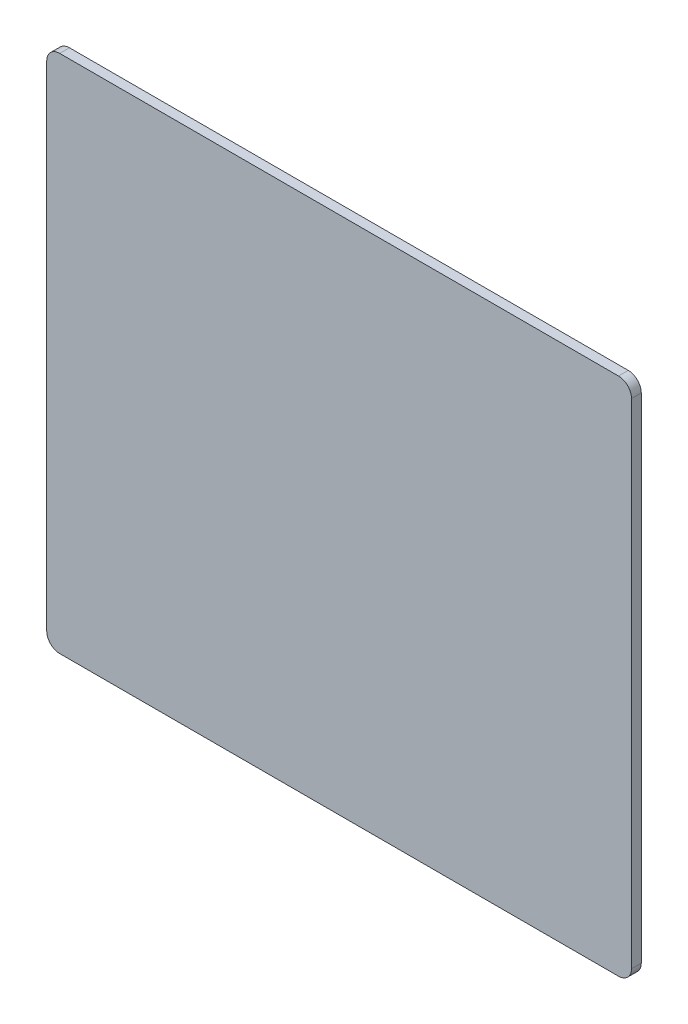
ISO-10303-21;
HEADER;
FILE_DESCRIPTION(('STEP AP214'),'2;1');
FILE_NAME('part.step','',(''),(''),'','','');
FILE_SCHEMA(('AUTOMOTIVE_DESIGN { 1 0 10303 214 1 1 1 1 }'));
ENDSEC;
DATA;
#1=APPLICATION_CONTEXT('core data for automotive mechanical design processes');
#2=APPLICATION_PROTOCOL_DEFINITION('international standard','automotive_design',2000,#1);
#3=PRODUCT_CONTEXT('',#1,'mechanical');
#4=PRODUCT('Part','Part','',(#3));
#5=PRODUCT_RELATED_PRODUCT_CATEGORY('part','',(#4));
#6=PRODUCT_DEFINITION_FORMATION('','',#4);
#7=PRODUCT_DEFINITION_CONTEXT('part definition',#1,'design');
#8=PRODUCT_DEFINITION('design','',#6,#7);
#9=PRODUCT_DEFINITION_SHAPE('','',#8);
#10=(LENGTH_UNIT() NAMED_UNIT(*) SI_UNIT(.MILLI.,.METRE.));
#11=(NAMED_UNIT(*) PLANE_ANGLE_UNIT() SI_UNIT($,.RADIAN.));
#12=(NAMED_UNIT(*) SI_UNIT($,.STERADIAN.) SOLID_ANGLE_UNIT());
#13=UNCERTAINTY_MEASURE_WITH_UNIT(LENGTH_MEASURE(1.E-05),#10,'distance_accuracy_value','');
#14=(GEOMETRIC_REPRESENTATION_CONTEXT(3) GLOBAL_UNCERTAINTY_ASSIGNED_CONTEXT((#13)) GLOBAL_UNIT_ASSIGNED_CONTEXT((#10,
#11,#12)) REPRESENTATION_CONTEXT('',''));
#15=CARTESIAN_POINT('',(0.,0.,0.));
#16=DIRECTION('',(0.,0.,1.));
#17=DIRECTION('',(1.,0.,0.));
#18=AXIS2_PLACEMENT_3D('',#15,#16,#17);
#19=CARTESIAN_POINT('',(51.5,17.1072744305229,-1.5));
#20=DIRECTION('',(0.,0.,1.));
#21=DIRECTION('',(1.,0.,0.));
#22=AXIS2_PLACEMENT_3D('',#19,#20,#21);
#23=CYLINDRICAL_SURFACE('',#22,2.);
#24=CARTESIAN_POINT('',(51.5,17.1072744305229,0.));
#25=DIRECTION('',(0.,0.,1.));
#26=DIRECTION('',(-1.,0.,0.));
#27=AXIS2_PLACEMENT_3D('',#24,#25,#26);
#28=CIRCLE('',#27,2.);
#29=CARTESIAN_POINT('',(53.5,17.1072744305229,0.));
#30=VERTEX_POINT('',#29);
#31=CARTESIAN_POINT('',(51.5,19.1072744305229,0.));
#32=VERTEX_POINT('',#31);
#33=EDGE_CURVE('E137',#30,#32,#28,.T.);
#34=ORIENTED_EDGE('',*,*,#33,.F.);
#35=DIRECTION('',(0.,0.,1.));
#36=VECTOR('',#35,1.);
#37=CARTESIAN_POINT('',(53.5,17.1072744305229,-1.5));
#38=LINE('',#37,#36);
#39=CARTESIAN_POINT('',(53.5,17.1072744305229,-1.5));
#40=VERTEX_POINT('',#39);
#41=EDGE_CURVE('E11',#40,#30,#38,.T.);
#42=ORIENTED_EDGE('',*,*,#41,.F.);
#43=CARTESIAN_POINT('',(51.5,17.1072744305229,-1.5));
#44=DIRECTION('',(0.,0.,1.));
#45=DIRECTION('',(-1.,0.,0.));
#46=AXIS2_PLACEMENT_3D('',#43,#44,#45);
#47=CIRCLE('',#46,2.);
#48=CARTESIAN_POINT('',(51.5,19.1072744305229,-1.5));
#49=VERTEX_POINT('',#48);
#50=EDGE_CURVE('E157',#40,#49,#47,.T.);
#51=ORIENTED_EDGE('',*,*,#50,.T.);
#52=DIRECTION('',(0.,0.,1.));
#53=VECTOR('',#52,1.);
#54=CARTESIAN_POINT('',(51.5,19.1072744305229,-1.5));
#55=LINE('',#54,#53);
#56=EDGE_CURVE('E43',#49,#32,#55,.T.);
#57=ORIENTED_EDGE('',*,*,#56,.T.);
#58=EDGE_LOOP('',(#34,#42,#51,#57));
#59=FACE_BOUND('',#58,.T.);
#60=ADVANCED_FACE('F40',(#59),#23,.T.);
#61=CARTESIAN_POINT('',(53.5,17.1072744305229,-1.5));
#62=DIRECTION('',(1.,0.,0.));
#63=DIRECTION('',(0.,1.,0.));
#64=AXIS2_PLACEMENT_3D('',#61,#62,#63);
#65=PLANE('',#64);
#66=DIRECTION('',(0.,1.,0.));
#67=VECTOR('',#66,1.);
#68=CARTESIAN_POINT('',(53.5,17.1072744305229,0.));
#69=LINE('',#68,#67);
#70=CARTESIAN_POINT('',(53.5,-58.8927255694771,0.));
#71=VERTEX_POINT('',#70);
#72=EDGE_CURVE('E155',#71,#30,#69,.T.);
#73=ORIENTED_EDGE('',*,*,#72,.F.);
#74=DIRECTION('',(0.,0.,1.));
#75=VECTOR('',#74,1.);
#76=CARTESIAN_POINT('',(53.5,-58.8927255694771,-1.5));
#77=LINE('',#76,#75);
#78=CARTESIAN_POINT('',(53.5,-58.8927255694771,-1.5));
#79=VERTEX_POINT('',#78);
#80=EDGE_CURVE('E49',#79,#71,#77,.T.);
#81=ORIENTED_EDGE('',*,*,#80,.F.);
#82=DIRECTION('',(0.,1.,0.));
#83=VECTOR('',#82,1.);
#84=CARTESIAN_POINT('',(53.5,17.1072744305229,-1.5));
#85=LINE('',#84,#83);
#86=EDGE_CURVE('E127',#79,#40,#85,.T.);
#87=ORIENTED_EDGE('',*,*,#86,.T.);
#88=ORIENTED_EDGE('',*,*,#41,.T.);
#89=EDGE_LOOP('',(#73,#81,#87,#88));
#90=FACE_BOUND('',#89,.T.);
#91=ADVANCED_FACE('F169',(#90),#65,.T.);
#92=CARTESIAN_POINT('',(51.5,-58.8927255694771,-1.5));
#93=DIRECTION('',(0.,0.,1.));
#94=DIRECTION('',(1.,0.,0.));
#95=AXIS2_PLACEMENT_3D('',#92,#93,#94);
#96=CYLINDRICAL_SURFACE('',#95,2.);
#97=CARTESIAN_POINT('',(51.5,-58.8927255694771,0.));
#98=DIRECTION('',(0.,0.,1.));
#99=DIRECTION('',(-1.,0.,0.));
#100=AXIS2_PLACEMENT_3D('',#97,#98,#99);
#101=CIRCLE('',#100,2.);
#102=CARTESIAN_POINT('',(51.5,-60.8927255694771,0.));
#103=VERTEX_POINT('',#102);
#104=EDGE_CURVE('E114',#103,#71,#101,.T.);
#105=ORIENTED_EDGE('',*,*,#104,.F.);
#106=DIRECTION('',(0.,0.,1.));
#107=VECTOR('',#106,1.);
#108=CARTESIAN_POINT('',(51.5,-60.8927255694771,-1.5));
#109=LINE('',#108,#107);
#110=CARTESIAN_POINT('',(51.5,-60.8927255694771,-1.5));
#111=VERTEX_POINT('',#110);
#112=EDGE_CURVE('E109',#111,#103,#109,.T.);
#113=ORIENTED_EDGE('',*,*,#112,.F.);
#114=CARTESIAN_POINT('',(51.5,-58.8927255694771,-1.5));
#115=DIRECTION('',(0.,0.,1.));
#116=DIRECTION('',(-1.,0.,0.));
#117=AXIS2_PLACEMENT_3D('',#114,#115,#116);
#118=CIRCLE('',#117,2.);
#119=EDGE_CURVE('E112',#111,#79,#118,.T.);
#120=ORIENTED_EDGE('',*,*,#119,.T.);
#121=ORIENTED_EDGE('',*,*,#80,.T.);
#122=EDGE_LOOP('',(#105,#113,#120,#121));
#123=FACE_BOUND('',#122,.T.);
#124=ADVANCED_FACE('F111',(#123),#96,.T.);
#125=CARTESIAN_POINT('',(51.5,-60.8927255694771,-1.5));
#126=DIRECTION('',(0.,-1.,0.));
#127=DIRECTION('',(1.,0.,0.));
#128=AXIS2_PLACEMENT_3D('',#125,#126,#127);
#129=PLANE('',#128);
#130=DIRECTION('',(1.,0.,0.));
#131=VECTOR('',#130,1.);
#132=CARTESIAN_POINT('',(51.5,-60.8927255694771,0.));
#133=LINE('',#132,#131);
#134=CARTESIAN_POINT('',(-34.5,-60.8927255694771,0.));
#135=VERTEX_POINT('',#134);
#136=EDGE_CURVE('E152',#135,#103,#133,.T.);
#137=ORIENTED_EDGE('',*,*,#136,.F.);
#138=DIRECTION('',(0.,0.,1.));
#139=VECTOR('',#138,1.);
#140=CARTESIAN_POINT('',(-34.5,-60.8927255694771,-1.5));
#141=LINE('',#140,#139);
#142=CARTESIAN_POINT('',(-34.5,-60.8927255694771,-1.5));
#143=VERTEX_POINT('',#142);
#144=EDGE_CURVE('E119',#143,#135,#141,.T.);
#145=ORIENTED_EDGE('',*,*,#144,.F.);
#146=DIRECTION('',(1.,0.,0.));
#147=VECTOR('',#146,1.);
#148=CARTESIAN_POINT('',(51.5,-60.8927255694771,-1.5));
#149=LINE('',#148,#147);
#150=EDGE_CURVE('E125',#143,#111,#149,.T.);
#151=ORIENTED_EDGE('',*,*,#150,.T.);
#152=ORIENTED_EDGE('',*,*,#112,.T.);
#153=EDGE_LOOP('',(#137,#145,#151,#152));
#154=FACE_BOUND('',#153,.T.);
#155=ADVANCED_FACE('F129',(#154),#129,.T.);
#156=CARTESIAN_POINT('',(-34.5,-58.8927255694771,-1.5));
#157=DIRECTION('',(0.,0.,1.));
#158=DIRECTION('',(1.,0.,0.));
#159=AXIS2_PLACEMENT_3D('',#156,#157,#158);
#160=CYLINDRICAL_SURFACE('',#159,2.);
#161=CARTESIAN_POINT('',(-34.5,-58.8927255694771,0.));
#162=DIRECTION('',(0.,0.,1.));
#163=DIRECTION('',(-1.,0.,0.));
#164=AXIS2_PLACEMENT_3D('',#161,#162,#163);
#165=CIRCLE('',#164,2.);
#166=CARTESIAN_POINT('',(-36.5,-58.8927255694771,0.));
#167=VERTEX_POINT('',#166);
#168=EDGE_CURVE('E149',#167,#135,#165,.T.);
#169=ORIENTED_EDGE('',*,*,#168,.F.);
#170=DIRECTION('',(0.,0.,1.));
#171=VECTOR('',#170,1.);
#172=CARTESIAN_POINT('',(-36.5,-58.8927255694771,-1.5));
#173=LINE('',#172,#171);
#174=CARTESIAN_POINT('',(-36.5,-58.8927255694771,-1.5));
#175=VERTEX_POINT('',#174);
#176=EDGE_CURVE('E161',#175,#167,#173,.T.);
#177=ORIENTED_EDGE('',*,*,#176,.F.);
#178=CARTESIAN_POINT('',(-34.5,-58.8927255694771,-1.5));
#179=DIRECTION('',(0.,0.,1.));
#180=DIRECTION('',(-1.,0.,0.));
#181=AXIS2_PLACEMENT_3D('',#178,#179,#180);
#182=CIRCLE('',#181,2.);
#183=EDGE_CURVE('E130',#175,#143,#182,.T.);
#184=ORIENTED_EDGE('',*,*,#183,.T.);
#185=ORIENTED_EDGE('',*,*,#144,.T.);
#186=EDGE_LOOP('',(#169,#177,#184,#185));
#187=FACE_BOUND('',#186,.T.);
#188=ADVANCED_FACE('F182',(#187),#160,.T.);
#189=CARTESIAN_POINT('',(-36.5,17.1072744305229,-1.5));
#190=DIRECTION('',(-1.,0.,0.));
#191=DIRECTION('',(0.,-1.,0.));
#192=AXIS2_PLACEMENT_3D('',#189,#190,#191);
#193=PLANE('',#192);
#194=DIRECTION('',(0.,-1.,0.));
#195=VECTOR('',#194,1.);
#196=CARTESIAN_POINT('',(-36.5,17.1072744305229,0.));
#197=LINE('',#196,#195);
#198=CARTESIAN_POINT('',(-36.5,17.1072744305229,0.));
#199=VERTEX_POINT('',#198);
#200=EDGE_CURVE('E146',#199,#167,#197,.T.);
#201=ORIENTED_EDGE('',*,*,#200,.F.);
#202=DIRECTION('',(0.,0.,1.));
#203=VECTOR('',#202,1.);
#204=CARTESIAN_POINT('',(-36.5,17.1072744305229,-1.5));
#205=LINE('',#204,#203);
#206=CARTESIAN_POINT('',(-36.5,17.1072744305229,-1.5));
#207=VERTEX_POINT('',#206);
#208=EDGE_CURVE('E163',#207,#199,#205,.T.);
#209=ORIENTED_EDGE('',*,*,#208,.F.);
#210=DIRECTION('',(0.,-1.,0.));
#211=VECTOR('',#210,1.);
#212=CARTESIAN_POINT('',(-36.5,17.1072744305229,-1.5));
#213=LINE('',#212,#211);
#214=EDGE_CURVE('E132',#207,#175,#213,.T.);
#215=ORIENTED_EDGE('',*,*,#214,.T.);
#216=ORIENTED_EDGE('',*,*,#176,.T.);
#217=EDGE_LOOP('',(#201,#209,#215,#216));
#218=FACE_BOUND('',#217,.T.);
#219=ADVANCED_FACE('F185',(#218),#193,.T.);
#220=CARTESIAN_POINT('',(-34.5,17.1072744305229,-1.5));
#221=DIRECTION('',(0.,0.,1.));
#222=DIRECTION('',(1.,0.,0.));
#223=AXIS2_PLACEMENT_3D('',#220,#221,#222);
#224=CYLINDRICAL_SURFACE('',#223,2.);
#225=CARTESIAN_POINT('',(-34.5,17.1072744305229,0.));
#226=DIRECTION('',(0.,0.,1.));
#227=DIRECTION('',(1.,0.,0.));
#228=AXIS2_PLACEMENT_3D('',#225,#226,#227);
#229=CIRCLE('',#228,2.);
#230=CARTESIAN_POINT('',(-34.5,19.1072744305229,0.));
#231=VERTEX_POINT('',#230);
#232=EDGE_CURVE('E143',#231,#199,#229,.T.);
#233=ORIENTED_EDGE('',*,*,#232,.F.);
#234=DIRECTION('',(0.,0.,1.));
#235=VECTOR('',#234,1.);
#236=CARTESIAN_POINT('',(-34.5,19.1072744305229,-1.5));
#237=LINE('',#236,#235);
#238=CARTESIAN_POINT('',(-34.5,19.1072744305229,-1.5));
#239=VERTEX_POINT('',#238);
#240=EDGE_CURVE('E164',#239,#231,#237,.T.);
#241=ORIENTED_EDGE('',*,*,#240,.F.);
#242=CARTESIAN_POINT('',(-34.5,17.1072744305229,-1.5));
#243=DIRECTION('',(0.,0.,1.));
#244=DIRECTION('',(1.,0.,0.));
#245=AXIS2_PLACEMENT_3D('',#242,#243,#244);
#246=CIRCLE('',#245,2.);
#247=EDGE_CURVE('E300',#239,#207,#246,.T.);
#248=ORIENTED_EDGE('',*,*,#247,.T.);
#249=ORIENTED_EDGE('',*,*,#208,.T.);
#250=EDGE_LOOP('',(#233,#241,#248,#249));
#251=FACE_BOUND('',#250,.T.);
#252=ADVANCED_FACE('F189',(#251),#224,.T.);
#253=CARTESIAN_POINT('',(51.5,19.1072744305229,-1.5));
#254=DIRECTION('',(0.,1.,0.));
#255=DIRECTION('',(-1.,0.,0.));
#256=AXIS2_PLACEMENT_3D('',#253,#254,#255);
#257=PLANE('',#256);
#258=DIRECTION('',(-1.,0.,0.));
#259=VECTOR('',#258,1.);
#260=CARTESIAN_POINT('',(51.5,19.1072744305229,0.));
#261=LINE('',#260,#259);
#262=EDGE_CURVE('E140',#32,#231,#261,.T.);
#263=ORIENTED_EDGE('',*,*,#262,.F.);
#264=ORIENTED_EDGE('',*,*,#56,.F.);
#265=DIRECTION('',(-1.,0.,0.));
#266=VECTOR('',#265,1.);
#267=CARTESIAN_POINT('',(51.5,19.1072744305229,-1.5));
#268=LINE('',#267,#266);
#269=EDGE_CURVE('E301',#49,#239,#268,.T.);
#270=ORIENTED_EDGE('',*,*,#269,.T.);
#271=ORIENTED_EDGE('',*,*,#240,.T.);
#272=EDGE_LOOP('',(#263,#264,#270,#271));
#273=FACE_BOUND('',#272,.T.);
#274=ADVANCED_FACE('F166',(#273),#257,.T.);
#275=CARTESIAN_POINT('',(51.5,17.1072744305229,-1.5));
#276=DIRECTION('',(0.,0.,-1.));
#277=DIRECTION('',(-1.,0.,0.));
#278=AXIS2_PLACEMENT_3D('',#275,#276,#277);
#279=PLANE('',#278);
#280=ORIENTED_EDGE('',*,*,#50,.F.);
#281=ORIENTED_EDGE('',*,*,#86,.F.);
#282=ORIENTED_EDGE('',*,*,#119,.F.);
#283=ORIENTED_EDGE('',*,*,#150,.F.);
#284=ORIENTED_EDGE('',*,*,#183,.F.);
#285=ORIENTED_EDGE('',*,*,#214,.F.);
#286=ORIENTED_EDGE('',*,*,#247,.F.);
#287=ORIENTED_EDGE('',*,*,#269,.F.);
#288=EDGE_LOOP('',(#280,#281,#282,#283,#284,#285,#286,#287));
#289=FACE_BOUND('',#288,.T.);
#290=ADVANCED_FACE('F123',(#289),#279,.T.);
#291=CARTESIAN_POINT('',(51.5,17.1072744305229,0.));
#292=DIRECTION('',(0.,0.,-1.));
#293=DIRECTION('',(-1.,0.,0.));
#294=AXIS2_PLACEMENT_3D('',#291,#292,#293);
#295=PLANE('',#294);
#296=ORIENTED_EDGE('',*,*,#33,.T.);
#297=ORIENTED_EDGE('',*,*,#262,.T.);
#298=ORIENTED_EDGE('',*,*,#232,.T.);
#299=ORIENTED_EDGE('',*,*,#200,.T.);
#300=ORIENTED_EDGE('',*,*,#168,.T.);
#301=ORIENTED_EDGE('',*,*,#136,.T.);
#302=ORIENTED_EDGE('',*,*,#104,.T.);
#303=ORIENTED_EDGE('',*,*,#72,.T.);
#304=EDGE_LOOP('',(#296,#297,#298,#299,#300,#301,#302,#303));
#305=FACE_BOUND('',#304,.T.);
#306=ADVANCED_FACE('F168',(#305),#295,.F.);
#307=CLOSED_SHELL('',(#60,#91,#124,#155,#188,#219,#252,#274,#290,#306));
#308=MANIFOLD_SOLID_BREP('B2',#307);
#309=ADVANCED_BREP_SHAPE_REPRESENTATION('',(#18,#308),#14);
#310=SHAPE_DEFINITION_REPRESENTATION(#9,#309);
ENDSEC;
END-ISO-10303-21;
